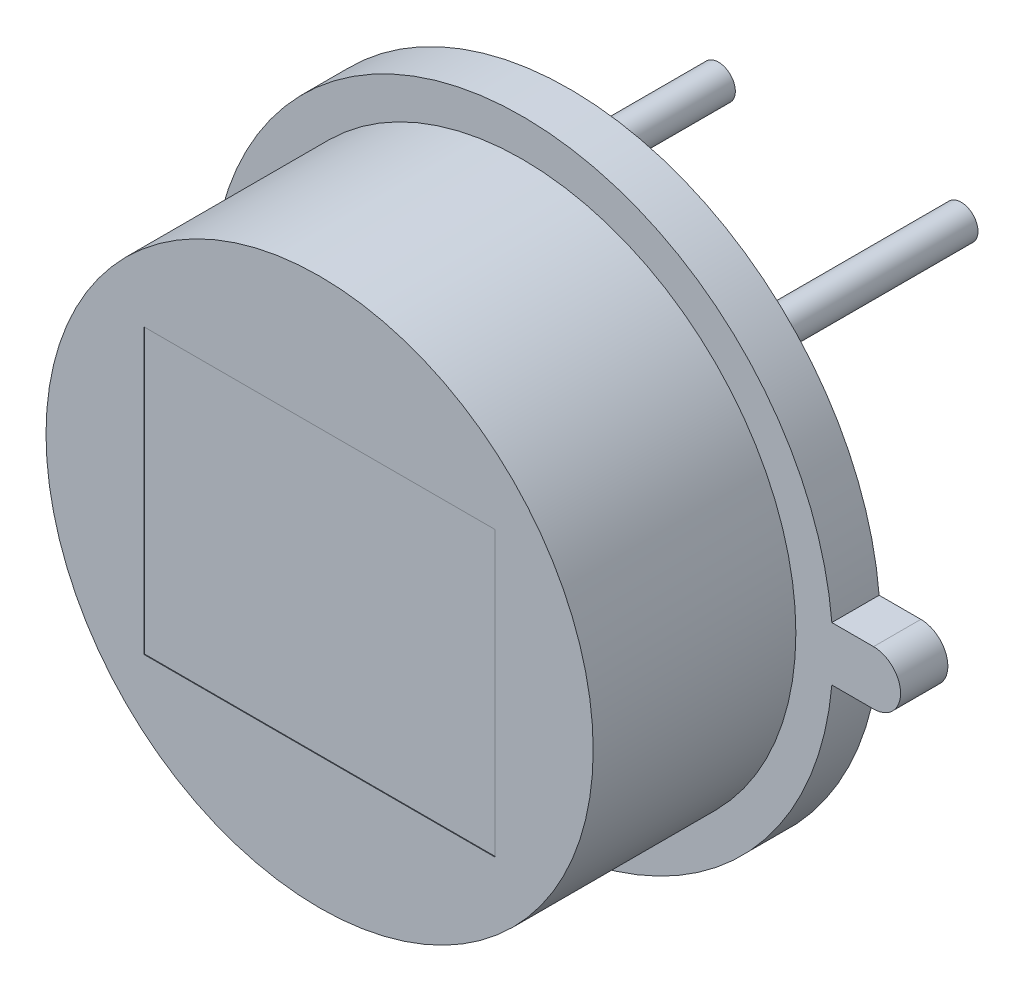
ISO-10303-21;
HEADER;
FILE_DESCRIPTION(('STEP AP214'),'2;1');
FILE_NAME('part.step','',(''),(''),'','','');
FILE_SCHEMA(('AUTOMOTIVE_DESIGN { 1 0 10303 214 1 1 1 1 }'));
ENDSEC;
DATA;
#1=APPLICATION_CONTEXT('core data for automotive mechanical design processes');
#2=APPLICATION_PROTOCOL_DEFINITION('international standard','automotive_design',2000,#1);
#3=PRODUCT_CONTEXT('',#1,'mechanical');
#4=PRODUCT('Part','Part','',(#3));
#5=PRODUCT_RELATED_PRODUCT_CATEGORY('part','',(#4));
#6=PRODUCT_DEFINITION_FORMATION('','',#4);
#7=PRODUCT_DEFINITION_CONTEXT('part definition',#1,'design');
#8=PRODUCT_DEFINITION('design','',#6,#7);
#9=PRODUCT_DEFINITION_SHAPE('','',#8);
#10=(LENGTH_UNIT() NAMED_UNIT(*) SI_UNIT(.MILLI.,.METRE.));
#11=(NAMED_UNIT(*) PLANE_ANGLE_UNIT() SI_UNIT($,.RADIAN.));
#12=(NAMED_UNIT(*) SI_UNIT($,.STERADIAN.) SOLID_ANGLE_UNIT());
#13=UNCERTAINTY_MEASURE_WITH_UNIT(LENGTH_MEASURE(1.E-05),#10,'distance_accuracy_value','');
#14=(GEOMETRIC_REPRESENTATION_CONTEXT(3) GLOBAL_UNCERTAINTY_ASSIGNED_CONTEXT((#13)) GLOBAL_UNIT_ASSIGNED_CONTEXT((#10,
#11,#12)) REPRESENTATION_CONTEXT('',''));
#15=CARTESIAN_POINT('',(0.,0.,0.));
#16=DIRECTION('',(0.,0.,1.));
#17=DIRECTION('',(1.,0.,0.));
#18=AXIS2_PLACEMENT_3D('',#15,#16,#17);
#19=CARTESIAN_POINT('',(0.,0.,0.7));
#20=DIRECTION('',(0.,0.,-1.));
#21=DIRECTION('',(-1.,0.,0.));
#22=AXIS2_PLACEMENT_3D('',#19,#20,#21);
#23=CYLINDRICAL_SURFACE('',#22,4.6);
#24=CARTESIAN_POINT('',(0.,0.,0.));
#25=DIRECTION('',(0.,0.,1.));
#26=DIRECTION('',(1.,0.,0.));
#27=AXIS2_PLACEMENT_3D('',#24,#25,#26);
#28=CIRCLE('',#27,4.6);
#29=CARTESIAN_POINT('',(4.58257569495584,0.4,0.));
#30=VERTEX_POINT('',#29);
#31=CARTESIAN_POINT('',(4.58257569495584,-0.4,0.));
#32=VERTEX_POINT('',#31);
#33=EDGE_CURVE('E156',#30,#32,#28,.T.);
#34=ORIENTED_EDGE('',*,*,#33,.T.);
#35=DIRECTION('',(0.,0.,-1.));
#36=VECTOR('',#35,1.);
#37=CARTESIAN_POINT('',(4.58257569495584,-0.4,0.7));
#38=LINE('',#37,#36);
#39=CARTESIAN_POINT('',(4.58257569495584,-0.4,0.7));
#40=VERTEX_POINT('',#39);
#41=EDGE_CURVE('E40',#40,#32,#38,.T.);
#42=ORIENTED_EDGE('',*,*,#41,.F.);
#43=CARTESIAN_POINT('',(0.,0.,0.7));
#44=DIRECTION('',(0.,0.,1.));
#45=DIRECTION('',(1.,0.,0.));
#46=AXIS2_PLACEMENT_3D('',#43,#44,#45);
#47=CIRCLE('',#46,4.6);
#48=CARTESIAN_POINT('',(4.58257569495584,0.4,0.7));
#49=VERTEX_POINT('',#48);
#50=EDGE_CURVE('E158',#49,#40,#47,.T.);
#51=ORIENTED_EDGE('',*,*,#50,.F.);
#52=DIRECTION('',(0.,0.,-1.));
#53=VECTOR('',#52,1.);
#54=CARTESIAN_POINT('',(4.58257569495584,0.4,0.7));
#55=LINE('',#54,#53);
#56=EDGE_CURVE('E164',#49,#30,#55,.T.);
#57=ORIENTED_EDGE('',*,*,#56,.T.);
#58=EDGE_LOOP('',(#34,#42,#51,#57));
#59=FACE_BOUND('',#58,.T.);
#60=ADVANCED_FACE('F37',(#59),#23,.T.);
#61=CARTESIAN_POINT('',(5.2,-0.4,0.7));
#62=DIRECTION('',(0.,1.,0.));
#63=DIRECTION('',(-1.,0.,0.));
#64=AXIS2_PLACEMENT_3D('',#61,#62,#63);
#65=PLANE('',#64);
#66=DIRECTION('',(1.,0.,0.));
#67=VECTOR('',#66,1.);
#68=CARTESIAN_POINT('',(5.2,-0.4,0.));
#69=LINE('',#68,#67);
#70=CARTESIAN_POINT('',(5.2,-0.4,0.));
#71=VERTEX_POINT('',#70);
#72=EDGE_CURVE('E167',#32,#71,#69,.T.);
#73=ORIENTED_EDGE('',*,*,#72,.T.);
#74=DIRECTION('',(0.,0.,-1.));
#75=VECTOR('',#74,1.);
#76=CARTESIAN_POINT('',(5.2,-0.4,0.7));
#77=LINE('',#76,#75);
#78=CARTESIAN_POINT('',(5.2,-0.4,0.7));
#79=VERTEX_POINT('',#78);
#80=EDGE_CURVE('E174',#79,#71,#77,.T.);
#81=ORIENTED_EDGE('',*,*,#80,.F.);
#82=DIRECTION('',(1.,0.,0.));
#83=VECTOR('',#82,1.);
#84=CARTESIAN_POINT('',(5.2,-0.4,0.7));
#85=LINE('',#84,#83);
#86=EDGE_CURVE('E90',#40,#79,#85,.T.);
#87=ORIENTED_EDGE('',*,*,#86,.F.);
#88=ORIENTED_EDGE('',*,*,#41,.T.);
#89=EDGE_LOOP('',(#73,#81,#87,#88));
#90=FACE_BOUND('',#89,.T.);
#91=ADVANCED_FACE('F180',(#90),#65,.F.);
#92=CARTESIAN_POINT('',(5.2,0.,0.7));
#93=DIRECTION('',(0.,0.,-1.));
#94=DIRECTION('',(-1.,0.,0.));
#95=AXIS2_PLACEMENT_3D('',#92,#93,#94);
#96=CYLINDRICAL_SURFACE('',#95,0.4);
#97=CARTESIAN_POINT('',(5.2,0.,0.));
#98=DIRECTION('',(0.,0.,1.));
#99=DIRECTION('',(1.,0.,0.));
#100=AXIS2_PLACEMENT_3D('',#97,#98,#99);
#101=CIRCLE('',#100,0.4);
#102=CARTESIAN_POINT('',(5.2,0.4,0.));
#103=VERTEX_POINT('',#102);
#104=EDGE_CURVE('E169',#71,#103,#101,.T.);
#105=ORIENTED_EDGE('',*,*,#104,.T.);
#106=DIRECTION('',(0.,0.,-1.));
#107=VECTOR('',#106,1.);
#108=CARTESIAN_POINT('',(5.2,0.4,0.7));
#109=LINE('',#108,#107);
#110=CARTESIAN_POINT('',(5.2,0.4,0.7));
#111=VERTEX_POINT('',#110);
#112=EDGE_CURVE('E173',#111,#103,#109,.T.);
#113=ORIENTED_EDGE('',*,*,#112,.F.);
#114=CARTESIAN_POINT('',(5.2,0.,0.7));
#115=DIRECTION('',(0.,0.,1.));
#116=DIRECTION('',(1.,0.,0.));
#117=AXIS2_PLACEMENT_3D('',#114,#115,#116);
#118=CIRCLE('',#117,0.4);
#119=EDGE_CURVE('E161',#79,#111,#118,.T.);
#120=ORIENTED_EDGE('',*,*,#119,.F.);
#121=ORIENTED_EDGE('',*,*,#80,.T.);
#122=EDGE_LOOP('',(#105,#113,#120,#121));
#123=FACE_BOUND('',#122,.T.);
#124=ADVANCED_FACE('F187',(#123),#96,.T.);
#125=CARTESIAN_POINT('',(5.2,0.4,0.7));
#126=DIRECTION('',(0.,-1.,0.));
#127=DIRECTION('',(1.,0.,0.));
#128=AXIS2_PLACEMENT_3D('',#125,#126,#127);
#129=PLANE('',#128);
#130=DIRECTION('',(-1.,0.,0.));
#131=VECTOR('',#130,1.);
#132=CARTESIAN_POINT('',(5.2,0.4,0.));
#133=LINE('',#132,#131);
#134=EDGE_CURVE('E82',#103,#30,#133,.T.);
#135=ORIENTED_EDGE('',*,*,#134,.T.);
#136=ORIENTED_EDGE('',*,*,#56,.F.);
#137=DIRECTION('',(-1.,0.,0.));
#138=VECTOR('',#137,1.);
#139=CARTESIAN_POINT('',(5.2,0.4,0.7));
#140=LINE('',#139,#138);
#141=EDGE_CURVE('E61',#111,#49,#140,.T.);
#142=ORIENTED_EDGE('',*,*,#141,.F.);
#143=ORIENTED_EDGE('',*,*,#112,.T.);
#144=EDGE_LOOP('',(#135,#136,#142,#143));
#145=FACE_BOUND('',#144,.T.);
#146=ADVANCED_FACE('F188',(#145),#129,.F.);
#147=CARTESIAN_POINT('',(0.,0.,0.7));
#148=DIRECTION('',(0.,0.,1.));
#149=DIRECTION('',(1.,0.,0.));
#150=AXIS2_PLACEMENT_3D('',#147,#148,#149);
#151=PLANE('',#150);
#152=CARTESIAN_POINT('',(0.,0.,0.7));
#153=DIRECTION('',(0.,0.,1.));
#154=DIRECTION('',(1.,0.,0.));
#155=AXIS2_PLACEMENT_3D('',#152,#153,#154);
#156=CIRCLE('',#155,4.05);
#157=CARTESIAN_POINT('',(4.05,0.,0.7));
#158=VERTEX_POINT('',#157);
#159=EDGE_CURVE('E11',#158,#158,#156,.T.);
#160=ORIENTED_EDGE('',*,*,#159,.F.);
#161=EDGE_LOOP('',(#160));
#162=FACE_BOUND('',#161,.T.);
#163=ORIENTED_EDGE('',*,*,#50,.T.);
#164=ORIENTED_EDGE('',*,*,#86,.T.);
#165=ORIENTED_EDGE('',*,*,#119,.T.);
#166=ORIENTED_EDGE('',*,*,#141,.T.);
#167=EDGE_LOOP('',(#163,#164,#165,#166));
#168=FACE_BOUND('',#167,.T.);
#169=ADVANCED_FACE('F189',(#162,#168),#151,.T.);
#170=CARTESIAN_POINT('',(0.,0.,0.));
#171=DIRECTION('',(0.,0.,1.));
#172=DIRECTION('',(1.,0.,0.));
#173=AXIS2_PLACEMENT_3D('',#170,#171,#172);
#174=PLANE('',#173);
#175=CARTESIAN_POINT('',(-1.796,-1.796,0.));
#176=DIRECTION('',(0.,0.,1.));
#177=DIRECTION('',(1.,0.,0.));
#178=AXIS2_PLACEMENT_3D('',#175,#176,#177);
#179=CIRCLE('',#178,0.25);
#180=CARTESIAN_POINT('',(-1.546,-1.796,0.));
#181=VERTEX_POINT('',#180);
#182=EDGE_CURVE('E358',#181,#181,#179,.T.);
#183=ORIENTED_EDGE('',*,*,#182,.T.);
#184=EDGE_LOOP('',(#183));
#185=FACE_BOUND('',#184,.T.);
#186=CARTESIAN_POINT('',(-1.796,1.796,0.));
#187=DIRECTION('',(0.,0.,1.));
#188=DIRECTION('',(1.,0.,0.));
#189=AXIS2_PLACEMENT_3D('',#186,#187,#188);
#190=CIRCLE('',#189,0.25);
#191=CARTESIAN_POINT('',(-1.546,1.796,0.));
#192=VERTEX_POINT('',#191);
#193=EDGE_CURVE('E357',#192,#192,#190,.T.);
#194=ORIENTED_EDGE('',*,*,#193,.T.);
#195=EDGE_LOOP('',(#194));
#196=FACE_BOUND('',#195,.T.);
#197=CARTESIAN_POINT('',(1.796,1.796,0.));
#198=DIRECTION('',(0.,0.,1.));
#199=DIRECTION('',(1.,0.,0.));
#200=AXIS2_PLACEMENT_3D('',#197,#198,#199);
#201=CIRCLE('',#200,0.25);
#202=CARTESIAN_POINT('',(2.046,1.796,0.));
#203=VERTEX_POINT('',#202);
#204=EDGE_CURVE('E138',#203,#203,#201,.T.);
#205=ORIENTED_EDGE('',*,*,#204,.T.);
#206=EDGE_LOOP('',(#205));
#207=FACE_BOUND('',#206,.T.);
#208=ORIENTED_EDGE('',*,*,#33,.F.);
#209=ORIENTED_EDGE('',*,*,#134,.F.);
#210=ORIENTED_EDGE('',*,*,#104,.F.);
#211=ORIENTED_EDGE('',*,*,#72,.F.);
#212=EDGE_LOOP('',(#208,#209,#210,#211));
#213=FACE_BOUND('',#212,.T.);
#214=ADVANCED_FACE('F185',(#185,#196,#207,#213),#174,.F.);
#215=CARTESIAN_POINT('',(0.,0.,3.7));
#216=DIRECTION('',(0.,0.,-1.));
#217=DIRECTION('',(-1.,0.,0.));
#218=AXIS2_PLACEMENT_3D('',#215,#216,#217);
#219=CYLINDRICAL_SURFACE('',#218,4.05);
#220=CARTESIAN_POINT('',(0.,0.,3.7));
#221=DIRECTION('',(0.,0.,1.));
#222=DIRECTION('',(1.,0.,0.));
#223=AXIS2_PLACEMENT_3D('',#220,#221,#222);
#224=CIRCLE('',#223,4.05);
#225=CARTESIAN_POINT('',(4.05,0.,3.7));
#226=VERTEX_POINT('',#225);
#227=EDGE_CURVE('E151',#226,#226,#224,.T.);
#228=ORIENTED_EDGE('',*,*,#227,.F.);
#229=EDGE_LOOP('',(#228));
#230=FACE_BOUND('',#229,.T.);
#231=ORIENTED_EDGE('',*,*,#159,.T.);
#232=EDGE_LOOP('',(#231));
#233=FACE_BOUND('',#232,.T.);
#234=ADVANCED_FACE('F197',(#230,#233),#219,.T.);
#235=CARTESIAN_POINT('',(0.,0.,3.7));
#236=DIRECTION('',(0.,0.,1.));
#237=DIRECTION('',(1.,0.,0.));
#238=AXIS2_PLACEMENT_3D('',#235,#236,#237);
#239=PLANE('',#238);
#240=DIRECTION('',(0.,1.,0.));
#241=VECTOR('',#240,1.);
#242=CARTESIAN_POINT('',(2.6,-2.1,3.7));
#243=LINE('',#242,#241);
#244=CARTESIAN_POINT('',(2.6,-2.1,3.7));
#245=VERTEX_POINT('',#244);
#246=CARTESIAN_POINT('',(2.6,2.1,3.7));
#247=VERTEX_POINT('',#246);
#248=EDGE_CURVE('E52',#245,#247,#243,.T.);
#249=ORIENTED_EDGE('',*,*,#248,.F.);
#250=DIRECTION('',(1.,0.,0.));
#251=VECTOR('',#250,1.);
#252=CARTESIAN_POINT('',(-2.6,-2.1,3.7));
#253=LINE('',#252,#251);
#254=CARTESIAN_POINT('',(-2.6,-2.1,3.7));
#255=VERTEX_POINT('',#254);
#256=EDGE_CURVE('E132',#255,#245,#253,.T.);
#257=ORIENTED_EDGE('',*,*,#256,.F.);
#258=DIRECTION('',(0.,-1.,0.));
#259=VECTOR('',#258,1.);
#260=CARTESIAN_POINT('',(-2.6,-2.1,3.7));
#261=LINE('',#260,#259);
#262=CARTESIAN_POINT('',(-2.6,2.1,3.7));
#263=VERTEX_POINT('',#262);
#264=EDGE_CURVE('E135',#263,#255,#261,.T.);
#265=ORIENTED_EDGE('',*,*,#264,.F.);
#266=DIRECTION('',(-1.,0.,0.));
#267=VECTOR('',#266,1.);
#268=CARTESIAN_POINT('',(-2.6,2.1,3.7));
#269=LINE('',#268,#267);
#270=EDGE_CURVE('E144',#247,#263,#269,.T.);
#271=ORIENTED_EDGE('',*,*,#270,.F.);
#272=EDGE_LOOP('',(#249,#257,#265,#271));
#273=FACE_BOUND('',#272,.T.);
#274=ORIENTED_EDGE('',*,*,#227,.T.);
#275=EDGE_LOOP('',(#274));
#276=FACE_BOUND('',#275,.T.);
#277=ADVANCED_FACE('F231',(#273,#276),#239,.T.);
#278=CARTESIAN_POINT('',(2.6,-2.1,3.69));
#279=DIRECTION('',(1.,0.,0.));
#280=DIRECTION('',(0.,0.,-1.));
#281=AXIS2_PLACEMENT_3D('',#278,#279,#280);
#282=PLANE('',#281);
#283=ORIENTED_EDGE('',*,*,#248,.T.);
#284=DIRECTION('',(0.,0.,1.));
#285=VECTOR('',#284,1.);
#286=CARTESIAN_POINT('',(2.6,2.1,3.69));
#287=LINE('',#286,#285);
#288=CARTESIAN_POINT('',(2.6,2.1,3.69));
#289=VERTEX_POINT('',#288);
#290=EDGE_CURVE('E110',#289,#247,#287,.T.);
#291=ORIENTED_EDGE('',*,*,#290,.F.);
#292=DIRECTION('',(0.,1.,0.));
#293=VECTOR('',#292,1.);
#294=CARTESIAN_POINT('',(2.6,-2.1,3.69));
#295=LINE('',#294,#293);
#296=CARTESIAN_POINT('',(2.6,-2.1,3.69));
#297=VERTEX_POINT('',#296);
#298=EDGE_CURVE('E114',#297,#289,#295,.T.);
#299=ORIENTED_EDGE('',*,*,#298,.F.);
#300=DIRECTION('',(0.,0.,1.));
#301=VECTOR('',#300,1.);
#302=CARTESIAN_POINT('',(2.6,-2.1,3.69));
#303=LINE('',#302,#301);
#304=EDGE_CURVE('E149',#297,#245,#303,.T.);
#305=ORIENTED_EDGE('',*,*,#304,.T.);
#306=EDGE_LOOP('',(#283,#291,#299,#305));
#307=FACE_BOUND('',#306,.T.);
#308=ADVANCED_FACE('F112',(#307),#282,.F.);
#309=CARTESIAN_POINT('',(-2.6,-2.1,3.69));
#310=DIRECTION('',(0.,-1.,0.));
#311=DIRECTION('',(0.,0.,-1.));
#312=AXIS2_PLACEMENT_3D('',#309,#310,#311);
#313=PLANE('',#312);
#314=ORIENTED_EDGE('',*,*,#256,.T.);
#315=ORIENTED_EDGE('',*,*,#304,.F.);
#316=DIRECTION('',(1.,0.,0.));
#317=VECTOR('',#316,1.);
#318=CARTESIAN_POINT('',(-2.6,-2.1,3.69));
#319=LINE('',#318,#317);
#320=CARTESIAN_POINT('',(-2.6,-2.1,3.69));
#321=VERTEX_POINT('',#320);
#322=EDGE_CURVE('E120',#321,#297,#319,.T.);
#323=ORIENTED_EDGE('',*,*,#322,.F.);
#324=DIRECTION('',(0.,0.,1.));
#325=VECTOR('',#324,1.);
#326=CARTESIAN_POINT('',(-2.6,-2.1,3.69));
#327=LINE('',#326,#325);
#328=EDGE_CURVE('E152',#321,#255,#327,.T.);
#329=ORIENTED_EDGE('',*,*,#328,.T.);
#330=EDGE_LOOP('',(#314,#315,#323,#329));
#331=FACE_BOUND('',#330,.T.);
#332=ADVANCED_FACE('F249',(#331),#313,.F.);
#333=CARTESIAN_POINT('',(-2.6,-2.1,3.69));
#334=DIRECTION('',(-1.,0.,0.));
#335=DIRECTION('',(0.,0.,1.));
#336=AXIS2_PLACEMENT_3D('',#333,#334,#335);
#337=PLANE('',#336);
#338=ORIENTED_EDGE('',*,*,#264,.T.);
#339=ORIENTED_EDGE('',*,*,#328,.F.);
#340=DIRECTION('',(0.,-1.,0.));
#341=VECTOR('',#340,1.);
#342=CARTESIAN_POINT('',(-2.6,-2.1,3.69));
#343=LINE('',#342,#341);
#344=CARTESIAN_POINT('',(-2.6,2.1,3.69));
#345=VERTEX_POINT('',#344);
#346=EDGE_CURVE('E128',#345,#321,#343,.T.);
#347=ORIENTED_EDGE('',*,*,#346,.F.);
#348=DIRECTION('',(0.,0.,1.));
#349=VECTOR('',#348,1.);
#350=CARTESIAN_POINT('',(-2.6,2.1,3.69));
#351=LINE('',#350,#349);
#352=EDGE_CURVE('E119',#345,#263,#351,.T.);
#353=ORIENTED_EDGE('',*,*,#352,.T.);
#354=EDGE_LOOP('',(#338,#339,#347,#353));
#355=FACE_BOUND('',#354,.T.);
#356=ADVANCED_FACE('F258',(#355),#337,.F.);
#357=CARTESIAN_POINT('',(-2.6,2.1,3.69));
#358=DIRECTION('',(0.,1.,0.));
#359=DIRECTION('',(0.,0.,1.));
#360=AXIS2_PLACEMENT_3D('',#357,#358,#359);
#361=PLANE('',#360);
#362=ORIENTED_EDGE('',*,*,#270,.T.);
#363=ORIENTED_EDGE('',*,*,#352,.F.);
#364=DIRECTION('',(-1.,0.,0.));
#365=VECTOR('',#364,1.);
#366=CARTESIAN_POINT('',(-2.6,2.1,3.69));
#367=LINE('',#366,#365);
#368=EDGE_CURVE('E123',#289,#345,#367,.T.);
#369=ORIENTED_EDGE('',*,*,#368,.F.);
#370=ORIENTED_EDGE('',*,*,#290,.T.);
#371=EDGE_LOOP('',(#362,#363,#369,#370));
#372=FACE_BOUND('',#371,.T.);
#373=ADVANCED_FACE('F124',(#372),#361,.F.);
#374=CARTESIAN_POINT('',(0.,0.,3.69));
#375=DIRECTION('',(0.,0.,-1.));
#376=DIRECTION('',(-1.,0.,0.));
#377=AXIS2_PLACEMENT_3D('',#374,#375,#376);
#378=PLANE('',#377);
#379=ORIENTED_EDGE('',*,*,#298,.T.);
#380=ORIENTED_EDGE('',*,*,#368,.T.);
#381=ORIENTED_EDGE('',*,*,#346,.T.);
#382=ORIENTED_EDGE('',*,*,#322,.T.);
#383=EDGE_LOOP('',(#379,#380,#381,#382));
#384=FACE_BOUND('',#383,.T.);
#385=ADVANCED_FACE('F130',(#384),#378,.F.);
#386=CARTESIAN_POINT('',(1.796,1.796,-4.));
#387=DIRECTION('',(0.,0.,1.));
#388=DIRECTION('',(1.,0.,0.));
#389=AXIS2_PLACEMENT_3D('',#386,#387,#388);
#390=CYLINDRICAL_SURFACE('',#389,0.25);
#391=CARTESIAN_POINT('',(1.796,1.796,-4.));
#392=DIRECTION('',(0.,0.,1.));
#393=DIRECTION('',(1.,0.,0.));
#394=AXIS2_PLACEMENT_3D('',#391,#392,#393);
#395=CIRCLE('',#394,0.25);
#396=CARTESIAN_POINT('',(2.046,1.796,-4.));
#397=VERTEX_POINT('',#396);
#398=EDGE_CURVE('E145',#397,#397,#395,.T.);
#399=ORIENTED_EDGE('',*,*,#398,.T.);
#400=EDGE_LOOP('',(#399));
#401=FACE_BOUND('',#400,.T.);
#402=ORIENTED_EDGE('',*,*,#204,.F.);
#403=EDGE_LOOP('',(#402));
#404=FACE_BOUND('',#403,.T.);
#405=ADVANCED_FACE('F285',(#401,#404),#390,.T.);
#406=CARTESIAN_POINT('',(1.796,1.796,-4.));
#407=DIRECTION('',(0.,0.,1.));
#408=DIRECTION('',(1.,0.,0.));
#409=AXIS2_PLACEMENT_3D('',#406,#407,#408);
#410=PLANE('',#409);
#411=ORIENTED_EDGE('',*,*,#398,.F.);
#412=EDGE_LOOP('',(#411));
#413=FACE_BOUND('',#412,.T.);
#414=ADVANCED_FACE('F300',(#413),#410,.F.);
#415=CARTESIAN_POINT('',(-1.796,1.796,-4.));
#416=DIRECTION('',(0.,0.,1.));
#417=DIRECTION('',(1.,0.,0.));
#418=AXIS2_PLACEMENT_3D('',#415,#416,#417);
#419=CYLINDRICAL_SURFACE('',#418,0.25);
#420=CARTESIAN_POINT('',(-1.796,1.796,-4.));
#421=DIRECTION('',(0.,0.,1.));
#422=DIRECTION('',(1.,0.,0.));
#423=AXIS2_PLACEMENT_3D('',#420,#421,#422);
#424=CIRCLE('',#423,0.25);
#425=CARTESIAN_POINT('',(-1.546,1.796,-4.));
#426=VERTEX_POINT('',#425);
#427=EDGE_CURVE('E361',#426,#426,#424,.T.);
#428=ORIENTED_EDGE('',*,*,#427,.T.);
#429=EDGE_LOOP('',(#428));
#430=FACE_BOUND('',#429,.T.);
#431=ORIENTED_EDGE('',*,*,#193,.F.);
#432=EDGE_LOOP('',(#431));
#433=FACE_BOUND('',#432,.T.);
#434=ADVANCED_FACE('F310',(#430,#433),#419,.T.);
#435=CARTESIAN_POINT('',(-1.796,1.796,-4.));
#436=DIRECTION('',(0.,0.,1.));
#437=DIRECTION('',(1.,0.,0.));
#438=AXIS2_PLACEMENT_3D('',#435,#436,#437);
#439=PLANE('',#438);
#440=ORIENTED_EDGE('',*,*,#427,.F.);
#441=EDGE_LOOP('',(#440));
#442=FACE_BOUND('',#441,.T.);
#443=ADVANCED_FACE('F320',(#442),#439,.F.);
#444=CARTESIAN_POINT('',(-1.796,-1.796,-4.));
#445=DIRECTION('',(0.,0.,1.));
#446=DIRECTION('',(1.,0.,0.));
#447=AXIS2_PLACEMENT_3D('',#444,#445,#446);
#448=CYLINDRICAL_SURFACE('',#447,0.25);
#449=CARTESIAN_POINT('',(-1.796,-1.796,-4.));
#450=DIRECTION('',(0.,0.,1.));
#451=DIRECTION('',(1.,0.,0.));
#452=AXIS2_PLACEMENT_3D('',#449,#450,#451);
#453=CIRCLE('',#452,0.25);
#454=CARTESIAN_POINT('',(-1.546,-1.796,-4.));
#455=VERTEX_POINT('',#454);
#456=EDGE_CURVE('E356',#455,#455,#453,.T.);
#457=ORIENTED_EDGE('',*,*,#456,.T.);
#458=EDGE_LOOP('',(#457));
#459=FACE_BOUND('',#458,.T.);
#460=ORIENTED_EDGE('',*,*,#182,.F.);
#461=EDGE_LOOP('',(#460));
#462=FACE_BOUND('',#461,.T.);
#463=ADVANCED_FACE('F330',(#459,#462),#448,.T.);
#464=CARTESIAN_POINT('',(-1.796,-1.796,-4.));
#465=DIRECTION('',(0.,0.,1.));
#466=DIRECTION('',(1.,0.,0.));
#467=AXIS2_PLACEMENT_3D('',#464,#465,#466);
#468=PLANE('',#467);
#469=ORIENTED_EDGE('',*,*,#456,.F.);
#470=EDGE_LOOP('',(#469));
#471=FACE_BOUND('',#470,.T.);
#472=ADVANCED_FACE('F340',(#471),#468,.F.);
#473=CLOSED_SHELL('',(#60,#91,#124,#146,#169,#214,#234,#277,#308,#332,#356,#373,#385,#405,#414,
#434,#443,#463,#472));
#474=MANIFOLD_SOLID_BREP('B2',#473);
#475=ADVANCED_BREP_SHAPE_REPRESENTATION('',(#18,#474),#14);
#476=SHAPE_DEFINITION_REPRESENTATION(#9,#475);
ENDSEC;
END-ISO-10303-21;
